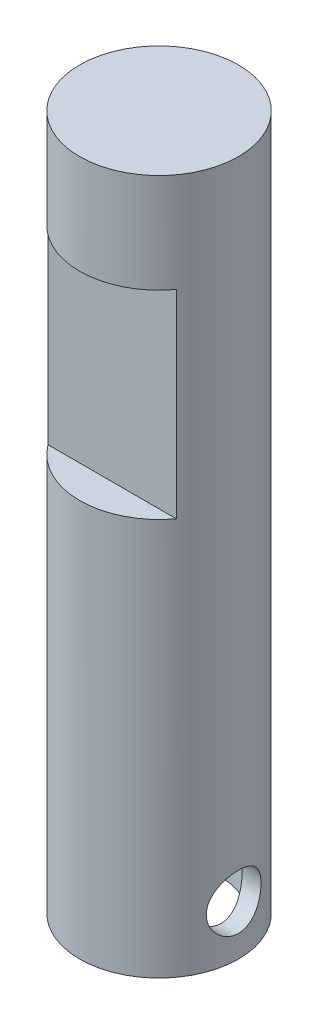
ISO-10303-21;
HEADER;
FILE_DESCRIPTION(('STEP AP214'),'2;1');
FILE_NAME('part.step','',(''),(''),'','','');
FILE_SCHEMA(('AUTOMOTIVE_DESIGN { 1 0 10303 214 1 1 1 1 }'));
ENDSEC;
DATA;
#1=APPLICATION_CONTEXT('core data for automotive mechanical design processes');
#2=APPLICATION_PROTOCOL_DEFINITION('international standard','automotive_design',2000,#1);
#3=PRODUCT_CONTEXT('',#1,'mechanical');
#4=PRODUCT('Part','Part','',(#3));
#5=PRODUCT_RELATED_PRODUCT_CATEGORY('part','',(#4));
#6=PRODUCT_DEFINITION_FORMATION('','',#4);
#7=PRODUCT_DEFINITION_CONTEXT('part definition',#1,'design');
#8=PRODUCT_DEFINITION('design','',#6,#7);
#9=PRODUCT_DEFINITION_SHAPE('','',#8);
#10=(LENGTH_UNIT() NAMED_UNIT(*) SI_UNIT(.MILLI.,.METRE.));
#11=(NAMED_UNIT(*) PLANE_ANGLE_UNIT() SI_UNIT($,.RADIAN.));
#12=(NAMED_UNIT(*) SI_UNIT($,.STERADIAN.) SOLID_ANGLE_UNIT());
#13=UNCERTAINTY_MEASURE_WITH_UNIT(LENGTH_MEASURE(1.E-05),#10,'distance_accuracy_value','');
#14=(GEOMETRIC_REPRESENTATION_CONTEXT(3) GLOBAL_UNCERTAINTY_ASSIGNED_CONTEXT((#13)) GLOBAL_UNIT_ASSIGNED_CONTEXT((#10,
#11,#12)) REPRESENTATION_CONTEXT('',''));
#15=CARTESIAN_POINT('',(0.,0.,0.));
#16=DIRECTION('',(0.,0.,1.));
#17=DIRECTION('',(1.,0.,0.));
#18=AXIS2_PLACEMENT_3D('',#15,#16,#17);
#19=CARTESIAN_POINT('',(-4.09956095210207,44.45,3.));
#20=DIRECTION('',(0.,0.,-1.));
#21=DIRECTION('',(1.,0.,0.));
#22=AXIS2_PLACEMENT_3D('',#19,#20,#21);
#23=PLANE('',#22);
#24=DIRECTION('',(0.,-1.,0.));
#25=VECTOR('',#24,1.);
#26=CARTESIAN_POINT('',(-4.09956095210207,44.45,3.));
#27=LINE('',#26,#25);
#28=CARTESIAN_POINT('',(-4.09956095210207,38.1,3.));
#29=VERTEX_POINT('',#28);
#30=CARTESIAN_POINT('',(-4.09956095210207,25.4,3.));
#31=VERTEX_POINT('',#30);
#32=EDGE_CURVE('E56',#29,#31,#27,.T.);
#33=ORIENTED_EDGE('',*,*,#32,.T.);
#34=DIRECTION('',(-1.,0.,0.));
#35=VECTOR('',#34,1.);
#36=CARTESIAN_POINT('',(-4.09956095210207,25.4,3.));
#37=LINE('',#36,#35);
#38=CARTESIAN_POINT('',(4.09956095210207,25.4,3.));
#39=VERTEX_POINT('',#38);
#40=EDGE_CURVE('E150',#39,#31,#37,.T.);
#41=ORIENTED_EDGE('',*,*,#40,.F.);
#42=DIRECTION('',(0.,-1.,0.));
#43=VECTOR('',#42,1.);
#44=CARTESIAN_POINT('',(4.09956095210207,44.45,3.));
#45=LINE('',#44,#43);
#46=CARTESIAN_POINT('',(4.09956095210207,38.1,3.));
#47=VERTEX_POINT('',#46);
#48=EDGE_CURVE('E11',#47,#39,#45,.T.);
#49=ORIENTED_EDGE('',*,*,#48,.F.);
#50=DIRECTION('',(1.,0.,0.));
#51=VECTOR('',#50,1.);
#52=CARTESIAN_POINT('',(-4.09956095210207,38.1,3.));
#53=LINE('',#52,#51);
#54=EDGE_CURVE('E77',#29,#47,#53,.T.);
#55=ORIENTED_EDGE('',*,*,#54,.F.);
#56=EDGE_LOOP('',(#33,#41,#49,#55));
#57=FACE_BOUND('',#56,.T.);
#58=ADVANCED_FACE('F41',(#57),#23,.F.);
#59=CARTESIAN_POINT('',(0.,44.45,0.));
#60=DIRECTION('',(0.,-1.,0.));
#61=DIRECTION('',(0.,0.,1.));
#62=AXIS2_PLACEMENT_3D('',#59,#60,#61);
#63=CYLINDRICAL_SURFACE('',#62,5.08);
#64=CARTESIAN_POINT('',(-5.08,1.425,0.));
#65=CARTESIAN_POINT('',(-5.08000076417139,1.42499888298344,0.0953022894046354));
#66=CARTESIAN_POINT('',(-5.07729376806418,1.43281012606838,0.190596676623148));
#67=CARTESIAN_POINT('',(-5.06676259877077,1.46374527864878,0.378367669756982));
#68=CARTESIAN_POINT('',(-5.05893823434203,1.48686976041974,0.47084417022913));
#69=CARTESIAN_POINT('',(-5.03901989437365,1.54753702115389,0.650245310243442));
#70=CARTESIAN_POINT('',(-5.02693334790221,1.58505472238807,0.737179301137623));
#71=CARTESIAN_POINT('',(-4.99971650406148,1.67332640539515,0.903519559470689));
#72=CARTESIAN_POINT('',(-4.98458554458919,1.72408326715122,0.982924183876474));
#73=CARTESIAN_POINT('',(-4.95224369163693,1.83934569213979,1.13486510405637));
#74=CARTESIAN_POINT('',(-4.93498055615565,1.90425047545211,1.20708735593848));
#75=CARTESIAN_POINT('',(-4.90059932312551,2.04511803291619,1.3398654200046));
#76=CARTESIAN_POINT('',(-4.88348126144282,2.12108346175875,1.40041842329567));
#77=CARTESIAN_POINT('',(-4.85074524283585,2.28480469580415,1.50998326193888));
#78=CARTESIAN_POINT('',(-4.83519045490759,2.37285359415443,1.5585778443389));
#79=CARTESIAN_POINT('',(-4.80814126026735,2.55649635413827,1.64013337052184));
#80=CARTESIAN_POINT('',(-4.7966455179427,2.65208772126229,1.673099458024));
#81=CARTESIAN_POINT('',(-4.77956823029384,2.84451762278586,1.72126802641745));
#82=CARTESIAN_POINT('',(-4.77379041311777,2.94119014167376,1.73706200636142));
#83=CARTESIAN_POINT('',(-4.7682240603983,3.1359725044686,1.75228747211399));
#84=CARTESIAN_POINT('',(-4.76843352235059,3.23408185683982,1.75172442868868));
#85=CARTESIAN_POINT('',(-4.77464676631466,3.42381842371857,1.73470925747026));
#86=CARTESIAN_POINT('',(-4.7803647153572,3.51552693796071,1.7190409084115));
#87=CARTESIAN_POINT('',(-4.7964810683342,3.69492360970281,1.67354289391217));
#88=CARTESIAN_POINT('',(-4.80688006860106,3.78261125340394,1.64371142416492));
#89=CARTESIAN_POINT('',(-4.83138213156251,3.95321003018773,1.57024282036418));
#90=CARTESIAN_POINT('',(-4.84554477898035,4.0360154970476,1.52638105822024));
#91=CARTESIAN_POINT('',(-4.87595471261031,4.19333342515898,1.42625295769855));
#92=CARTESIAN_POINT('',(-4.89220263252777,4.26784335252389,1.36998284472751));
#93=CARTESIAN_POINT('',(-4.92606434263048,4.41084327761265,1.24291697117403));
#94=CARTESIAN_POINT('',(-4.94370366507709,4.47876240132104,1.17148418312147));
#95=CARTESIAN_POINT('',(-4.97756821276516,4.60181183787153,1.0180281654083));
#96=CARTESIAN_POINT('',(-4.99379328315644,4.65694075137539,0.936003778479532));
#97=CARTESIAN_POINT('',(-5.02324014996034,4.75334668663191,0.762419583781975));
#98=CARTESIAN_POINT('',(-5.03642618865668,4.79446126746685,0.670763072389918));
#99=CARTESIAN_POINT('',(-5.05804849306172,4.86050758126078,0.481270310648696));
#100=CARTESIAN_POINT('',(-5.06648652588555,4.88544533544783,0.383436374514577));
#101=CARTESIAN_POINT('',(-5.07736470824786,4.91739674973,0.189191562688342));
#102=CARTESIAN_POINT('',(-5.08006255074176,4.92518108784578,0.0929217284429427));
#103=CARTESIAN_POINT('',(-5.07993527174129,4.92481259103972,-0.0995737310802911));
#104=CARTESIAN_POINT('',(-5.07711115498479,4.91666265540917,-0.195799361214731));
#105=CARTESIAN_POINT('',(-5.06642755118415,4.88526116906746,-0.382327466649308));
#106=CARTESIAN_POINT('',(-5.05872860986491,4.86249079813248,-0.47272106198722));
#107=CARTESIAN_POINT('',(-5.03923022783173,4.80310457615501,-0.648362037037884));
#108=CARTESIAN_POINT('',(-5.02743025855858,4.76648694036023,-0.733608751734102));
#109=CARTESIAN_POINT('',(-5.00051950138979,4.67934532289421,-0.899127908413318));
#110=CARTESIAN_POINT('',(-4.98532728267042,4.62846970369632,-0.979201596971832));
#111=CARTESIAN_POINT('',(-4.95334472883728,4.51466497785025,-1.12992112454148));
#112=CARTESIAN_POINT('',(-4.93655387786689,4.45173197377301,-1.20056390254257));
#113=CARTESIAN_POINT('',(-4.90222616063926,4.31197933022608,-1.33400086887325));
#114=CARTESIAN_POINT('',(-4.88469277729518,4.23463274627004,-1.39624543446077));
#115=CARTESIAN_POINT('',(-4.8516851925527,4.07022171659723,-1.50695005136838));
#116=CARTESIAN_POINT('',(-4.83621104355525,3.98315702368928,-1.5554097519434));
#117=CARTESIAN_POINT('',(-4.80920827570578,3.80159517486444,-1.63700095794269));
#118=CARTESIAN_POINT('',(-4.79767683455897,3.70710339529585,-1.6701434338448));
#119=CARTESIAN_POINT('',(-4.78007607736265,3.51338547077514,-1.7198785637945));
#120=CARTESIAN_POINT('',(-4.77400407556927,3.41416167903974,-1.73647935587622));
#121=CARTESIAN_POINT('',(-4.76832880519632,3.2196445169891,-1.75199936276655));
#122=CARTESIAN_POINT('',(-4.76838950172282,3.124433472804,-1.75183708142949));
#123=CARTESIAN_POINT('',(-4.77413399674614,2.93547219974782,-1.73612009740496));
#124=CARTESIAN_POINT('',(-4.77981741544765,2.84172187264485,-1.7205664343517));
#125=CARTESIAN_POINT('',(-4.79590870235624,2.66037843893273,-1.67517649822772));
#126=CARTESIAN_POINT('',(-4.80621143526942,2.57269589259309,-1.64565729673398));
#127=CARTESIAN_POINT('',(-4.83033550622056,2.40346388522219,-1.57343621637384));
#128=CARTESIAN_POINT('',(-4.84415765713431,2.32191584671541,-1.53073129153142));
#129=CARTESIAN_POINT('',(-4.87455611963841,2.1631952851576,-1.43105993979702));
#130=CARTESIAN_POINT('',(-4.8912299318905,2.08639704796838,-1.37352745048766));
#131=CARTESIAN_POINT('',(-4.92506481046858,1.94324899744513,-1.24676977081576));
#132=CARTESIAN_POINT('',(-4.94222601772023,1.8769022431187,-1.17754116940141));
#133=CARTESIAN_POINT('',(-4.97598182225602,1.75367623225257,-1.02581147627507));
#134=CARTESIAN_POINT('',(-4.9925209515745,1.69732208706302,-0.942869931500976));
#135=CARTESIAN_POINT('',(-5.02237104941033,1.59940724242884,-0.768135099027858));
#136=CARTESIAN_POINT('',(-5.03568258139335,1.5578439602398,-0.676343360289376));
#137=CARTESIAN_POINT('',(-5.057313033813,1.49170746368237,-0.488579092856818));
#138=CARTESIAN_POINT('',(-5.06573637649884,1.46677704899873,-0.392744891698378));
#139=CARTESIAN_POINT('',(-5.07707856770794,1.43342658198853,-0.197936932159695));
#140=CARTESIAN_POINT('',(-5.07999920646593,1.42500115993705,-0.0989642055179746));
#141=CARTESIAN_POINT('',(-5.08,1.425,0.));
#142=B_SPLINE_CURVE_WITH_KNOTS('',3,(#64,#65,#66,#67,#68,#69,#70,#71,#72,#73,#74,#75,#76,#77,
#78,#79,#80,#81,#82,#83,#84,#85,#86,#87,#88,#89,#90,#91,#92,#93,#94,#95,#96,#97,#98,#99,#100,
#101,#102,#103,#104,#105,#106,#107,#108,#109,#110,#111,#112,#113,#114,#115,#116,#117,#118,#119,
#120,#121,#122,#123,#124,#125,#126,#127,#128,#129,#130,#131,#132,#133,#134,#135,#136,#137,#138,
#139,#140,#141),.UNSPECIFIED.,.T.,.F.,(4,2,2,2,2,2,2,2,2,2,2,2,2,2,2,2,2,2,2,2,2,2,2,2,2,2,2,2,
2,2,2,2,2,2,2,2,2,2,4),(0.,0.28554245735073,0.571095586393906,0.856153430964964,
1.14127333743709,1.43582379151039,1.73044505820538,2.03422433359474,2.33790355827745,
2.63075417899062,2.92350685408384,3.20184374340621,3.4802161008948,3.76328930846856,
4.04644874537624,4.34546697981625,4.64451791352625,4.94692583577289,5.24922113312124,
5.53763138501627,5.82598916464153,6.10531183706105,6.38467052321974,6.67163893049573,
6.95870025441647,7.259738612517,7.56078462961697,7.861614696605,8.16229669064574,
8.44651256584106,8.73070924455449,9.00874237277514,9.28683977632026,9.57774034565015,
9.86872590007664,10.1721342268066,10.4754895470881,10.7721002657753,11.0686144692629),.UNSPECIFIED.);
#143=CARTESIAN_POINT('',(-5.08,1.425,0.));
#144=VERTEX_POINT('',#143);
#145=EDGE_CURVE('E129',#144,#144,#142,.T.);
#146=ORIENTED_EDGE('',*,*,#145,.F.);
#147=EDGE_LOOP('',(#146));
#148=FACE_BOUND('',#147,.T.);
#149=CARTESIAN_POINT('',(4.7690565104641,3.175,1.75));
#150=CARTESIAN_POINT('',(4.76905556914904,3.07988747420598,1.75000115055899));
#151=CARTESIAN_POINT('',(4.7719329096654,2.98478292043442,1.74221982424718));
#152=CARTESIAN_POINT('',(4.78306637000255,2.79740440264574,1.71141431450612));
#153=CARTESIAN_POINT('',(4.79132307976023,2.7051307502461,1.68838845925741));
#154=CARTESIAN_POINT('',(4.81217143890979,2.52616153887322,1.62800914605608));
#155=CARTESIAN_POINT('',(4.82475411409451,2.43945486966273,1.59068533102593));
#156=CARTESIAN_POINT('',(4.85282324821151,2.27350401676104,1.50287190862797));
#157=CARTESIAN_POINT('',(4.86831041348106,2.19426165535709,1.45237909754841));
#158=CARTESIAN_POINT('',(4.90116976927398,2.04217469887006,1.3373989035908));
#159=CARTESIAN_POINT('',(4.91859121749096,1.96968747303741,1.27245277915461));
#160=CARTESIAN_POINT('',(4.95294128003509,1.83638763566958,1.13138709657144));
#161=CARTESIAN_POINT('',(4.9698698085748,1.77557704614716,1.05526560723552));
#162=CARTESIAN_POINT('',(5.00190083776634,1.66570978297738,0.891371207438888));
#163=CARTESIAN_POINT('',(5.01693870800215,1.61703114933825,0.80333112554146));
#164=CARTESIAN_POINT('',(5.04291070662366,1.53531811335215,0.619704280453341));
#165=CARTESIAN_POINT('',(5.0538460211813,1.50227918837186,0.524119708290492));
#166=CARTESIAN_POINT('',(5.07003171382049,1.45400588242238,0.331866809154855));
#167=CARTESIAN_POINT('',(5.07547728742448,1.43815852019928,0.235369140953188));
#168=CARTESIAN_POINT('',(5.0807647730657,1.4227652712637,0.0409408557045194));
#169=CARTESIAN_POINT('',(5.08060822560794,1.42321490310604,-0.0569893600078222));
#170=CARTESIAN_POINT('',(5.07483931379797,1.44002222149091,-0.247150116093957));
#171=CARTESIAN_POINT('',(5.06945556883223,1.45571331226731,-0.339447661898226));
#172=CARTESIAN_POINT('',(5.0541275142818,1.50145093581419,-0.520008887816919));
#173=CARTESIAN_POINT('',(5.04418289072104,1.5314984569036,-0.608272289756216));
#174=CARTESIAN_POINT('',(5.02056796587733,1.60546405389829,-0.779672864057162));
#175=CARTESIAN_POINT('',(5.00684890896013,1.64956493134931,-0.862724156143934));
#176=CARTESIAN_POINT('',(4.97710307831595,1.75023214660339,-1.02043880070284));
#177=CARTESIAN_POINT('',(4.96107563374108,1.80680211063098,-1.09509970354941));
#178=CARTESIAN_POINT('',(4.92744592703843,1.93412390476673,-1.23787149472358));
#179=CARTESIAN_POINT('',(4.90980499463016,2.00544398626107,-1.30546727076063));
#180=CARTESIAN_POINT('',(4.87560416397293,2.15854768847578,-1.42791298131385));
#181=CARTESIAN_POINT('',(4.85904445714819,2.24033315448165,-1.48276066323594));
#182=CARTESIAN_POINT('',(4.82866075249325,2.41377958306261,-1.57893310908967));
#183=CARTESIAN_POINT('',(4.81488521319719,2.50557860981672,-1.62002537024872));
#184=CARTESIAN_POINT('',(4.79218901649874,2.69538908468421,-1.68598805538193));
#185=CARTESIAN_POINT('',(4.78326615735245,2.79339769283005,-1.71086583716083));
#186=CARTESIAN_POINT('',(4.77178917017154,2.98782735160336,-1.7426133044508));
#187=CARTESIAN_POINT('',(4.76895099785174,3.08410034468289,-1.75028695290477));
#188=CARTESIAN_POINT('',(4.76916800232093,3.2765797249177,-1.74969675244721));
#189=CARTESIAN_POINT('',(4.77222201305147,3.37278612148323,-1.74143605693008));
#190=CARTESIAN_POINT('',(4.78359466867962,3.558629134808,-1.70993596023239));
#191=CARTESIAN_POINT('',(4.79171128864077,3.64837679174769,-1.68727074722903));
#192=CARTESIAN_POINT('',(4.81206786840227,3.82277176693781,-1.62830249292802));
#193=CARTESIAN_POINT('',(4.82430858986062,3.90741813965295,-1.59199693232564));
#194=CARTESIAN_POINT('',(4.85203832915389,4.07233565336124,-1.50540713933863));
#195=CARTESIAN_POINT('',(4.86762197904012,4.15236708169748,-1.45469749836615));
#196=CARTESIAN_POINT('',(4.90010462316924,4.30307419797249,-1.34121326936852));
#197=CARTESIAN_POINT('',(4.91700402923975,4.37374693782527,-1.27843489476082));
#198=CARTESIAN_POINT('',(4.95127565012691,4.5075284691492,-1.1387263364332));
#199=CARTESIAN_POINT('',(4.96862682758683,4.5700536791983,-1.06123044254898));
#200=CARTESIAN_POINT('',(5.00098757627087,4.68125832759988,-0.896418310268707));
#201=CARTESIAN_POINT('',(5.01599721243007,4.72993814994025,-0.809102344316199));
#202=CARTESIAN_POINT('',(5.0419258298284,4.81164702246801,-0.627485452305796));
#203=CARTESIAN_POINT('',(5.05286892162005,4.84476863695764,-0.533229799201697));
#204=CARTESIAN_POINT('',(5.06953271796469,4.89454028155123,-0.3400313655671));
#205=CARTESIAN_POINT('',(5.0752554510321,4.9111967098682,-0.241090421370121));
#206=CARTESIAN_POINT('',(5.08067037137377,4.92695893509937,-0.0466503973213572));
#207=CARTESIAN_POINT('',(5.08064956160638,4.92689998953546,0.0487736803247511));
#208=CARTESIAN_POINT('',(5.07529708655824,4.91131621938358,0.238189174721599));
#209=CARTESIAN_POINT('',(5.06996590259638,4.89579279645671,0.332180720529504));
#210=CARTESIAN_POINT('',(5.05470419403585,4.85028507686571,0.514375710295137));
#211=CARTESIAN_POINT('',(5.044857826666,4.82056498260139,0.602652706525786));
#212=CARTESIAN_POINT('',(5.02158108655565,4.74775637973396,0.772995362710569));
#213=CARTESIAN_POINT('',(5.00815005263131,4.70466540466266,0.855059873197275));
#214=CARTESIAN_POINT('',(4.97843483147227,4.60443590945816,1.01409288438825));
#215=CARTESIAN_POINT('',(4.96206078335882,4.54682088677738,1.09074403385586));
#216=CARTESIAN_POINT('',(4.92850099023844,4.4199733722534,1.23355969183976));
#217=CARTESIAN_POINT('',(4.91131497883972,4.35073704836595,1.29972072727337));
#218=CARTESIAN_POINT('',(4.8771902232275,4.19909083817359,1.42255286974433));
#219=CARTESIAN_POINT('',(4.86029319551149,4.11624542909985,1.47869968866723));
#220=CARTESIAN_POINT('',(4.82954132449233,3.94176306862256,1.57624826071803));
#221=CARTESIAN_POINT('',(4.81568594921604,3.85012765859078,1.61765259303836));
#222=CARTESIAN_POINT('',(4.7930480532757,3.66270261896825,1.68353371659624));
#223=CARTESIAN_POINT('',(4.78415804925797,3.56705351730717,1.70837163007594));
#224=CARTESIAN_POINT('',(4.77216395819655,3.37259919871254,1.74160078741207));
#225=CARTESIAN_POINT('',(4.76905748822704,3.27379529869097,1.74999880489118));
#226=CARTESIAN_POINT('',(4.7690565104641,3.175,1.75));
#227=B_SPLINE_CURVE_WITH_KNOTS('',3,(#149,#150,#151,#152,#153,#154,#155,#156,#157,#158,#159,
#160,#161,#162,#163,#164,#165,#166,#167,#168,#169,#170,#171,#172,#173,#174,#175,#176,#177,#178,
#179,#180,#181,#182,#183,#184,#185,#186,#187,#188,#189,#190,#191,#192,#193,#194,#195,#196,#197,
#198,#199,#200,#201,#202,#203,#204,#205,#206,#207,#208,#209,#210,#211,#212,#213,#214,#215,#216,
#217,#218,#219,#220,#221,#222,#223,#224,#225,#226),.UNSPECIFIED.,.T.,.F.,(4,2,2,2,2,2,2,2,2,2,2,
2,2,2,2,2,2,2,2,2,2,2,2,2,2,2,2,2,2,2,2,2,2,2,2,2,2,2,4),(0.,0.284971195180313,
0.569973647431364,0.854388394918185,1.13887239857133,1.4341628580342,1.72950440615435,
2.03313995737502,2.33668765066606,2.62901507806795,2.92126212013066,3.20127759380623,
3.48131234695925,3.76514955734467,4.04906942163075,4.34720470444387,4.64539262791601,
4.94839242856386,5.25125463808838,5.53963969117045,5.82796767892785,6.10546728392768,
6.38301816694734,6.66981576058982,6.95670348468211,7.25849315026459,7.56027444519834,
7.860236796492,8.16008253942545,8.4449479428232,8.7297875290905,9.00952129986325,
9.28930670261408,9.57985194581197,9.87049318319931,10.173514791287,10.4764833597812,
10.7726107243924,11.0686160518835),.UNSPECIFIED.);
#228=CARTESIAN_POINT('',(4.7690565104641,3.175,1.75));
#229=VERTEX_POINT('',#228);
#230=EDGE_CURVE('E132',#229,#229,#227,.T.);
#231=ORIENTED_EDGE('',*,*,#230,.F.);
#232=EDGE_LOOP('',(#231));
#233=FACE_BOUND('',#232,.T.);
#234=CARTESIAN_POINT('',(0.,38.1,0.));
#235=DIRECTION('',(0.,-1.,0.));
#236=DIRECTION('',(0.,0.,1.));
#237=AXIS2_PLACEMENT_3D('',#234,#235,#236);
#238=CIRCLE('',#237,5.08);
#239=EDGE_CURVE('E74',#47,#29,#238,.T.);
#240=ORIENTED_EDGE('',*,*,#239,.F.);
#241=ORIENTED_EDGE('',*,*,#48,.T.);
#242=CARTESIAN_POINT('',(0.,25.4,0.));
#243=DIRECTION('',(0.,1.,0.));
#244=DIRECTION('',(0.,0.,1.));
#245=AXIS2_PLACEMENT_3D('',#242,#243,#244);
#246=CIRCLE('',#245,5.08);
#247=EDGE_CURVE('E63',#31,#39,#246,.T.);
#248=ORIENTED_EDGE('',*,*,#247,.F.);
#249=ORIENTED_EDGE('',*,*,#32,.F.);
#250=EDGE_LOOP('',(#240,#241,#248,#249));
#251=FACE_BOUND('',#250,.T.);
#252=CARTESIAN_POINT('',(0.,0.,0.));
#253=DIRECTION('',(0.,-1.,0.));
#254=DIRECTION('',(0.,0.,-1.));
#255=AXIS2_PLACEMENT_3D('',#252,#253,#254);
#256=CIRCLE('',#255,5.08);
#257=CARTESIAN_POINT('',(0.,0.,-5.08));
#258=VERTEX_POINT('',#257);
#259=EDGE_CURVE('E89',#258,#258,#256,.T.);
#260=ORIENTED_EDGE('',*,*,#259,.F.);
#261=EDGE_LOOP('',(#260));
#262=FACE_BOUND('',#261,.T.);
#263=CARTESIAN_POINT('',(0.,44.45,0.));
#264=DIRECTION('',(0.,-1.,0.));
#265=DIRECTION('',(0.,0.,-1.));
#266=AXIS2_PLACEMENT_3D('',#263,#264,#265);
#267=CIRCLE('',#266,5.08);
#268=CARTESIAN_POINT('',(0.,44.45,-5.08));
#269=VERTEX_POINT('',#268);
#270=EDGE_CURVE('E86',#269,#269,#267,.T.);
#271=ORIENTED_EDGE('',*,*,#270,.T.);
#272=EDGE_LOOP('',(#271));
#273=FACE_BOUND('',#272,.T.);
#274=ADVANCED_FACE('F43',(#148,#233,#251,#262,#273),#63,.T.);
#275=CARTESIAN_POINT('',(0.,44.45,0.));
#276=DIRECTION('',(0.,1.,0.));
#277=DIRECTION('',(0.,0.,-1.));
#278=AXIS2_PLACEMENT_3D('',#275,#276,#277);
#279=PLANE('',#278);
#280=ORIENTED_EDGE('',*,*,#270,.F.);
#281=EDGE_LOOP('',(#280));
#282=FACE_BOUND('',#281,.T.);
#283=ADVANCED_FACE('F113',(#282),#279,.T.);
#284=CARTESIAN_POINT('',(0.,0.,0.));
#285=DIRECTION('',(0.,1.,0.));
#286=DIRECTION('',(0.,0.,-1.));
#287=AXIS2_PLACEMENT_3D('',#284,#285,#286);
#288=PLANE('',#287);
#289=CARTESIAN_POINT('',(0.,0.,0.));
#290=DIRECTION('',(0.,1.,0.));
#291=DIRECTION('',(0.,0.,1.));
#292=AXIS2_PLACEMENT_3D('',#289,#290,#291);
#293=CIRCLE('',#292,3.96875);
#294=CARTESIAN_POINT('',(0.,0.,3.96875));
#295=VERTEX_POINT('',#294);
#296=EDGE_CURVE('E135',#295,#295,#293,.T.);
#297=ORIENTED_EDGE('',*,*,#296,.T.);
#298=EDGE_LOOP('',(#297));
#299=FACE_BOUND('',#298,.T.);
#300=ORIENTED_EDGE('',*,*,#259,.T.);
#301=EDGE_LOOP('',(#300));
#302=FACE_BOUND('',#301,.T.);
#303=ADVANCED_FACE('F112',(#299,#302),#288,.F.);
#304=CARTESIAN_POINT('',(0.,25.4,0.));
#305=DIRECTION('',(0.,-1.,0.));
#306=DIRECTION('',(0.,0.,1.));
#307=AXIS2_PLACEMENT_3D('',#304,#305,#306);
#308=PLANE('',#307);
#309=ORIENTED_EDGE('',*,*,#247,.T.);
#310=ORIENTED_EDGE('',*,*,#40,.T.);
#311=EDGE_LOOP('',(#309,#310));
#312=FACE_BOUND('',#311,.T.);
#313=ADVANCED_FACE('F109',(#312),#308,.F.);
#314=CARTESIAN_POINT('',(0.,38.1,0.));
#315=DIRECTION('',(0.,-1.,0.));
#316=DIRECTION('',(0.,0.,1.));
#317=AXIS2_PLACEMENT_3D('',#314,#315,#316);
#318=PLANE('',#317);
#319=ORIENTED_EDGE('',*,*,#239,.T.);
#320=ORIENTED_EDGE('',*,*,#54,.T.);
#321=EDGE_LOOP('',(#319,#320));
#322=FACE_BOUND('',#321,.T.);
#323=ADVANCED_FACE('F76',(#322),#318,.T.);
#324=CARTESIAN_POINT('',(0.,6.35,0.));
#325=DIRECTION('',(0.,-1.,0.));
#326=DIRECTION('',(0.,0.,1.));
#327=AXIS2_PLACEMENT_3D('',#324,#325,#326);
#328=CYLINDRICAL_SURFACE('',#327,3.96875);
#329=CARTESIAN_POINT('',(-3.56208879205727,3.175,1.75));
#330=CARTESIAN_POINT('',(-3.56209353838593,3.08224740691797,1.74999563319547));
#331=CARTESIAN_POINT('',(-3.56576407056318,2.98934259981376,1.74257902061585));
#332=CARTESIAN_POINT('',(-3.57995211973844,2.80626235860172,1.71323438723364));
#333=CARTESIAN_POINT('',(-3.5904871603377,2.71609452964493,1.69126922476247));
#334=CARTESIAN_POINT('',(-3.61696251479822,2.54146570624595,1.63387370994394));
#335=CARTESIAN_POINT('',(-3.63287896212464,2.45698145522823,1.59850273000797));
#336=CARTESIAN_POINT('',(-3.66828751091445,2.29516823960994,1.51547774519868));
#337=CARTESIAN_POINT('',(-3.68777906305451,2.21783817849355,1.46782562689624));
#338=CARTESIAN_POINT('',(-3.72966266869336,2.06708166582086,1.35803293293338));
#339=CARTESIAN_POINT('',(-3.75216027824898,1.99421391145088,1.29516509833842));
#340=CARTESIAN_POINT('',(-3.7966585858724,1.85963705486942,1.15824885061117));
#341=CARTESIAN_POINT('',(-3.81865907520989,1.79793256639501,1.08419583778055));
#342=CARTESIAN_POINT('',(-3.86099382006362,1.68446054672912,0.922506160523575));
#343=CARTESIAN_POINT('',(-3.88119127911691,1.63333780227249,0.83437788622718));
#344=CARTESIAN_POINT('',(-3.91633169743546,1.54688960151139,0.649718371395728));
#345=CARTESIAN_POINT('',(-3.93127725444704,1.51155633290805,0.553191314708836));
#346=CARTESIAN_POINT('',(-3.95347834999868,1.45976542764851,0.360355757586166));
#347=CARTESIAN_POINT('',(-3.96112637963048,1.44233993556338,0.264353338726685));
#348=CARTESIAN_POINT('',(-3.96930722106238,1.42371534042764,0.0705036002533178));
#349=CARTESIAN_POINT('',(-3.96984328957249,1.42250881038484,-0.0273428543820264));
#350=CARTESIAN_POINT('',(-3.96395886355778,1.43588531871159,-0.215001917879778));
#351=CARTESIAN_POINT('',(-3.95800899588929,1.4494001107015,-0.304908340775179));
#352=CARTESIAN_POINT('',(-3.9404855814644,1.48998259360306,-0.481024011713773));
#353=CARTESIAN_POINT('',(-3.92891161837739,1.5170512878636,-0.567232985534499));
#354=CARTESIAN_POINT('',(-3.90101968793415,1.58426926754532,-0.735104863073158));
#355=CARTESIAN_POINT('',(-3.88463198291737,1.62461196920836,-0.816678254143855));
#356=CARTESIAN_POINT('',(-3.84868139397731,1.71702809000756,-0.972111971682959));
#357=CARTESIAN_POINT('',(-3.82911735624179,1.76910577458765,-1.04596947925099));
#358=CARTESIAN_POINT('',(-3.78695193640457,1.88819626988817,-1.18997020754851));
#359=CARTESIAN_POINT('',(-3.7642326663637,1.95605425426668,-1.25938087431697));
#360=CARTESIAN_POINT('',(-3.71941135415986,2.10243498505653,-1.38617737278033));
#361=CARTESIAN_POINT('',(-3.69730961437482,2.18096284941567,-1.44355740002509));
#362=CARTESIAN_POINT('',(-3.65532460083709,2.3504296743786,-1.54687431413554));
#363=CARTESIAN_POINT('',(-3.63556733412784,2.44174233830917,-1.59225401038565));
#364=CARTESIAN_POINT('',(-3.60205795871447,2.63181194458514,-1.66668544323578));
#365=CARTESIAN_POINT('',(-3.58830096562557,2.7305627549909,-1.69575046597237));
#366=CARTESIAN_POINT('',(-3.56960518418745,2.92534472715134,-1.73474330947598));
#367=CARTESIAN_POINT('',(-3.56411638258773,3.02108214651399,-1.74586863973841));
#368=CARTESIAN_POINT('',(-3.56100105508922,3.21319290466881,-1.75221765766862));
#369=CARTESIAN_POINT('',(-3.56337121546327,3.30956595834333,-1.74744804742538));
#370=CARTESIAN_POINT('',(-3.57513324783105,3.49252520823142,-1.7232383324921));
#371=CARTESIAN_POINT('',(-3.58398179461918,3.57930117106894,-1.70493236127572));
#372=CARTESIAN_POINT('',(-3.60697879849733,3.74845544413854,-1.65572114712787));
#373=CARTESIAN_POINT('',(-3.62112859785241,3.83083263457101,-1.62481271310638));
#374=CARTESIAN_POINT('',(-3.65389481747196,3.99296259218139,-1.54976490211927));
#375=CARTESIAN_POINT('',(-3.67268195932917,4.07243551616474,-1.50509802943803));
#376=CARTESIAN_POINT('',(-3.71238927150009,4.22316743507872,-1.40430554568507));
#377=CARTESIAN_POINT('',(-3.73331043383616,4.29442257679055,-1.34817459314898));
#378=CARTESIAN_POINT('',(-3.77727956071602,4.43362099149512,-1.21989455557735));
#379=CARTESIAN_POINT('',(-3.80034398865355,4.50063639388688,-1.14674005876275));
#380=CARTESIAN_POINT('',(-3.84422469457359,4.62164138857364,-0.989723349920827));
#381=CARTESIAN_POINT('',(-3.86504067624988,4.67562926522068,-0.905859729786865));
#382=CARTESIAN_POINT('',(-3.90233949997183,4.76925178626268,-0.728677439196114));
#383=CARTESIAN_POINT('',(-3.91878776807016,4.80877279273064,-0.635290981699206));
#384=CARTESIAN_POINT('',(-3.94522903213664,4.8712202956881,-0.442273890308923));
#385=CARTESIAN_POINT('',(-3.95522638147468,4.89415798460713,-0.34264751730459));
#386=CARTESIAN_POINT('',(-3.96708486555638,4.92125842265785,-0.148218466465073));
#387=CARTESIAN_POINT('',(-3.96951062715961,4.92672486607173,-0.0536309408712299));
#388=CARTESIAN_POINT('',(-3.96757122067091,4.92232672090087,0.135104825907965));
#389=CARTESIAN_POINT('',(-3.96320751248676,4.91246542816763,0.229253157165397));
#390=CARTESIAN_POINT('',(-3.94849255842105,4.87862346373568,0.4102177359374));
#391=CARTESIAN_POINT('',(-3.93840800526532,4.85527088780818,0.497175040256969));
#392=CARTESIAN_POINT('',(-3.913420989435,4.79583685216382,0.665875986453617));
#393=CARTESIAN_POINT('',(-3.89851767217411,4.7597531345322,0.747618700465384));
#394=CARTESIAN_POINT('',(-3.86445798292642,4.6740574513603,0.907714806758724));
#395=CARTESIAN_POINT('',(-3.84513801057888,4.62390132695005,0.985741229116449));
#396=CARTESIAN_POINT('',(-3.80446881641556,4.51223907776838,1.13261229457055));
#397=CARTESIAN_POINT('',(-3.78311874898595,4.45072821317317,1.20145308254436));
#398=CARTESIAN_POINT('',(-3.73869080353766,4.31251361184784,1.33356456338859));
#399=CARTESIAN_POINT('',(-3.71560713068347,4.23500231939152,1.39599136661912));
#400=CARTESIAN_POINT('',(-3.67193674837275,4.06996527552658,1.50712793845824));
#401=CARTESIAN_POINT('',(-3.65135157638443,3.98243342162634,1.55582928514161));
#402=CARTESIAN_POINT('',(-3.61524974380851,3.79920497474954,1.6379790330275));
#403=CARTESIAN_POINT('',(-3.59974592369513,3.70348845643481,1.67138887600855));
#404=CARTESIAN_POINT('',(-3.57621311955068,3.50702445583213,1.72117916216989));
#405=CARTESIAN_POINT('',(-3.56815906490183,3.4062950584507,1.73761674380392));
#406=CARTESIAN_POINT('',(-3.56366883587143,3.28332782715188,1.74677964847133));
#407=CARTESIAN_POINT('',(-3.56307756802898,3.26168661239528,1.74798610752484));
#408=CARTESIAN_POINT('',(-3.5622869863916,3.21836637296077,1.74959680371416));
#409=CARTESIAN_POINT('',(-3.56208768227397,3.19668734736256,1.75000102104323));
#410=CARTESIAN_POINT('',(-3.56208879205727,3.175,1.75));
#411=B_SPLINE_CURVE_WITH_KNOTS('',3,(#329,#330,#331,#332,#333,#334,#335,#336,#337,#338,#339,
#340,#341,#342,#343,#344,#345,#346,#347,#348,#349,#350,#351,#352,#353,#354,#355,#356,#357,#358,
#359,#360,#361,#362,#363,#364,#365,#366,#367,#368,#369,#370,#371,#372,#373,#374,#375,#376,#377,
#378,#379,#380,#381,#382,#383,#384,#385,#386,#387,#388,#389,#390,#391,#392,#393,#394,#395,#396,
#397,#398,#399,#400,#401,#402,#403,#404,#405,#406,#407,#408,#409,#410),.UNSPECIFIED.,.T.,.F.,(4,
2,2,2,2,2,2,2,2,2,2,2,2,2,2,2,2,2,2,2,2,2,2,2,2,2,2,2,2,2,2,2,2,2,2,2,2,2,2,2,4),(0.,
0.278166493433298,0.557045882401051,0.834704320937761,1.11232013228369,1.40754438936983,
1.70289038420353,2.01288757708766,2.3227312196294,2.61477292458695,2.90668089315732,
3.17873660303953,3.45081245525045,3.72704262376208,4.0033733591295,4.30113958614739,
4.5990491481955,4.90901711969207,5.21873229581556,5.50676075035845,5.79466777330182,
6.06085047730066,6.32710062375157,6.60519700096026,6.88342324856538,7.18758462827953,
7.49178604241135,7.79832814657264,8.10466316539236,8.38753046958766,8.67033695856148,
8.94093121191268,9.21157348029251,9.4946179362679,9.7777808121338,10.0828667001033,
10.3881393828817,10.6941776402949,10.9991822028825,11.0642212948376,11.1292619925394),.UNSPECIFIED.);
#412=CARTESIAN_POINT('',(-3.56208879205727,3.175,1.75));
#413=VERTEX_POINT('',#412);
#414=EDGE_CURVE('E46',#413,#413,#411,.T.);
#415=ORIENTED_EDGE('',*,*,#414,.F.);
#416=EDGE_LOOP('',(#415));
#417=FACE_BOUND('',#416,.T.);
#418=CARTESIAN_POINT('',(3.56208879205727,3.175,1.75));
#419=CARTESIAN_POINT('',(3.56209353838593,3.26775259308203,1.74999563319547));
#420=CARTESIAN_POINT('',(3.56576407056318,3.36065740018624,1.74257902061585));
#421=CARTESIAN_POINT('',(3.57995211973844,3.54373764139828,1.71323438723364));
#422=CARTESIAN_POINT('',(3.5904871603377,3.63390547035507,1.69126922476247));
#423=CARTESIAN_POINT('',(3.61696251479822,3.80853429375405,1.63387370994394));
#424=CARTESIAN_POINT('',(3.63287896212464,3.89301854477177,1.59850273000797));
#425=CARTESIAN_POINT('',(3.66828751091445,4.05483176039005,1.51547774519868));
#426=CARTESIAN_POINT('',(3.68777906305451,4.13216182150645,1.46782562689624));
#427=CARTESIAN_POINT('',(3.72966266869336,4.28291833417914,1.35803293293338));
#428=CARTESIAN_POINT('',(3.75216027824898,4.35578608854912,1.29516509833842));
#429=CARTESIAN_POINT('',(3.7966585858724,4.49036294513058,1.15824885061117));
#430=CARTESIAN_POINT('',(3.81865907520989,4.55206743360499,1.08419583778055));
#431=CARTESIAN_POINT('',(3.86099382006362,4.66553945327088,0.922506160523575));
#432=CARTESIAN_POINT('',(3.88119127911691,4.71666219772751,0.834377886227179));
#433=CARTESIAN_POINT('',(3.91633169743546,4.80311039848861,0.649718371395727));
#434=CARTESIAN_POINT('',(3.93127725444704,4.83844366709194,0.553191314708836));
#435=CARTESIAN_POINT('',(3.95347834999868,4.89023457235149,0.360355757586165));
#436=CARTESIAN_POINT('',(3.96112637963048,4.90766006443662,0.264353338726685));
#437=CARTESIAN_POINT('',(3.96930722106238,4.92628465957236,0.0705036002533174));
#438=CARTESIAN_POINT('',(3.96984328957249,4.92749118961516,-0.0273428543820268));
#439=CARTESIAN_POINT('',(3.96395886355778,4.91411468128841,-0.215001917879779));
#440=CARTESIAN_POINT('',(3.95800899588929,4.9005998892985,-0.304908340775179));
#441=CARTESIAN_POINT('',(3.9404855814644,4.86001740639694,-0.481024011713773));
#442=CARTESIAN_POINT('',(3.92891161837739,4.8329487121364,-0.567232985534499));
#443=CARTESIAN_POINT('',(3.90101968793415,4.76573073245468,-0.735104863073158));
#444=CARTESIAN_POINT('',(3.88463198291737,4.72538803079164,-0.816678254143855));
#445=CARTESIAN_POINT('',(3.84868139397731,4.63297190999244,-0.972111971682959));
#446=CARTESIAN_POINT('',(3.82911735624179,4.58089422541235,-1.04596947925099));
#447=CARTESIAN_POINT('',(3.78695193640457,4.46180373011183,-1.18997020754851));
#448=CARTESIAN_POINT('',(3.7642326663637,4.39394574573332,-1.25938087431697));
#449=CARTESIAN_POINT('',(3.71941135415986,4.24756501494346,-1.38617737278033));
#450=CARTESIAN_POINT('',(3.69730961437482,4.16903715058433,-1.44355740002509));
#451=CARTESIAN_POINT('',(3.65532460083709,3.9995703256214,-1.54687431413554));
#452=CARTESIAN_POINT('',(3.63556733412784,3.90825766169083,-1.59225401038565));
#453=CARTESIAN_POINT('',(3.60205795871447,3.71818805541486,-1.66668544323578));
#454=CARTESIAN_POINT('',(3.58830096562557,3.6194372450091,-1.69575046597237));
#455=CARTESIAN_POINT('',(3.56960518418745,3.42465527284866,-1.73474330947598));
#456=CARTESIAN_POINT('',(3.56411638258773,3.32891785348601,-1.74586863973841));
#457=CARTESIAN_POINT('',(3.56100105508922,3.13680709533119,-1.75221765766862));
#458=CARTESIAN_POINT('',(3.56337121546327,3.04043404165667,-1.74744804742538));
#459=CARTESIAN_POINT('',(3.57513324783105,2.85747479176858,-1.7232383324921));
#460=CARTESIAN_POINT('',(3.58398179461918,2.77069882893106,-1.70493236127572));
#461=CARTESIAN_POINT('',(3.60697879849733,2.60154455586146,-1.65572114712787));
#462=CARTESIAN_POINT('',(3.62112859785241,2.51916736542899,-1.62481271310638));
#463=CARTESIAN_POINT('',(3.65389481747196,2.35703740781861,-1.54976490211927));
#464=CARTESIAN_POINT('',(3.67268195932917,2.27756448383526,-1.50509802943803));
#465=CARTESIAN_POINT('',(3.71238927150009,2.12683256492128,-1.40430554568507));
#466=CARTESIAN_POINT('',(3.73331043383616,2.05557742320946,-1.34817459314898));
#467=CARTESIAN_POINT('',(3.77727956071602,1.91637900850488,-1.21989455557736));
#468=CARTESIAN_POINT('',(3.80034398865355,1.84936360611312,-1.14674005876275));
#469=CARTESIAN_POINT('',(3.84422469457359,1.72835861142636,-0.989723349920828));
#470=CARTESIAN_POINT('',(3.86504067624988,1.67437073477932,-0.905859729786866));
#471=CARTESIAN_POINT('',(3.90233949997183,1.58074821373732,-0.728677439196115));
#472=CARTESIAN_POINT('',(3.91878776807016,1.54122720726936,-0.635290981699207));
#473=CARTESIAN_POINT('',(3.94522903213664,1.4787797043119,-0.442273890308924));
#474=CARTESIAN_POINT('',(3.95522638147468,1.45584201539287,-0.342647517304591));
#475=CARTESIAN_POINT('',(3.96708486555638,1.42874157734215,-0.148218466465074));
#476=CARTESIAN_POINT('',(3.96951062715961,1.42327513392827,-0.0536309408712306));
#477=CARTESIAN_POINT('',(3.96757122067091,1.42767327909913,0.135104825907965));
#478=CARTESIAN_POINT('',(3.96320751248676,1.43753457183237,0.229253157165396));
#479=CARTESIAN_POINT('',(3.94849255842105,1.47137653626432,0.410217735937399));
#480=CARTESIAN_POINT('',(3.93840800526532,1.49472911219182,0.497175040256968));
#481=CARTESIAN_POINT('',(3.913420989435,1.55416314783618,0.665875986453616));
#482=CARTESIAN_POINT('',(3.89851767217411,1.5902468654678,0.747618700465384));
#483=CARTESIAN_POINT('',(3.86445798292642,1.6759425486397,0.907714806758724));
#484=CARTESIAN_POINT('',(3.84513801057888,1.72609867304995,0.985741229116449));
#485=CARTESIAN_POINT('',(3.80446881641556,1.83776092223162,1.13261229457055));
#486=CARTESIAN_POINT('',(3.78311874898595,1.89927178682683,1.20145308254436));
#487=CARTESIAN_POINT('',(3.73869080353766,2.03748638815215,1.33356456338859));
#488=CARTESIAN_POINT('',(3.71560713068347,2.11499768060848,1.39599136661912));
#489=CARTESIAN_POINT('',(3.67193674837275,2.28003472447342,1.50712793845824));
#490=CARTESIAN_POINT('',(3.65135157638443,2.36756657837366,1.55582928514161));
#491=CARTESIAN_POINT('',(3.61524974380851,2.55079502525046,1.6379790330275));
#492=CARTESIAN_POINT('',(3.59974592369513,2.64651154356518,1.67138887600855));
#493=CARTESIAN_POINT('',(3.57621311955068,2.84297554416787,1.72117916216989));
#494=CARTESIAN_POINT('',(3.56815906490183,2.9437049415493,1.73761674380392));
#495=CARTESIAN_POINT('',(3.56366883587143,3.06667217284812,1.74677964847133));
#496=CARTESIAN_POINT('',(3.56307756802898,3.08831338760472,1.74798610752484));
#497=CARTESIAN_POINT('',(3.5622869863916,3.13163362703923,1.74959680371416));
#498=CARTESIAN_POINT('',(3.56208768227397,3.15331265263744,1.75000102104323));
#499=CARTESIAN_POINT('',(3.56208879205727,3.175,1.75));
#500=B_SPLINE_CURVE_WITH_KNOTS('',3,(#418,#419,#420,#421,#422,#423,#424,#425,#426,#427,#428,
#429,#430,#431,#432,#433,#434,#435,#436,#437,#438,#439,#440,#441,#442,#443,#444,#445,#446,#447,
#448,#449,#450,#451,#452,#453,#454,#455,#456,#457,#458,#459,#460,#461,#462,#463,#464,#465,#466,
#467,#468,#469,#470,#471,#472,#473,#474,#475,#476,#477,#478,#479,#480,#481,#482,#483,#484,#485,
#486,#487,#488,#489,#490,#491,#492,#493,#494,#495,#496,#497,#498,#499),.UNSPECIFIED.,.T.,.F.,(4,
2,2,2,2,2,2,2,2,2,2,2,2,2,2,2,2,2,2,2,2,2,2,2,2,2,2,2,2,2,2,2,2,2,2,2,2,2,2,2,4),(0.,
0.278166493433298,0.557045882401051,0.83470432093776,1.11232013228369,1.40754438936983,
1.70289038420353,2.01288757708766,2.3227312196294,2.61477292458695,2.90668089315732,
3.17873660303953,3.45081245525045,3.72704262376208,4.0033733591295,4.30113958614739,
4.5990491481955,4.90901711969207,5.21873229581556,5.50676075035845,5.79466777330182,
6.06085047730066,6.32710062375157,6.60519700096026,6.88342324856538,7.18758462827953,
7.49178604241135,7.79832814657264,8.10466316539236,8.38753046958766,8.67033695856148,
8.94093121191268,9.21157348029251,9.4946179362679,9.7777808121338,10.0828667001033,
10.3881393828817,10.6941776402949,10.9991822028825,11.0642212948376,11.1292619925394),.UNSPECIFIED.);
#501=CARTESIAN_POINT('',(3.56208879205727,3.175,1.75));
#502=VERTEX_POINT('',#501);
#503=EDGE_CURVE('E92',#502,#502,#500,.T.);
#504=ORIENTED_EDGE('',*,*,#503,.F.);
#505=EDGE_LOOP('',(#504));
#506=FACE_BOUND('',#505,.T.);
#507=CARTESIAN_POINT('',(0.,6.35,0.));
#508=DIRECTION('',(0.,1.,0.));
#509=DIRECTION('',(0.,0.,1.));
#510=AXIS2_PLACEMENT_3D('',#507,#508,#509);
#511=CIRCLE('',#510,3.96875);
#512=CARTESIAN_POINT('',(0.,6.35,3.96875));
#513=VERTEX_POINT('',#512);
#514=EDGE_CURVE('E79',#513,#513,#511,.T.);
#515=ORIENTED_EDGE('',*,*,#514,.T.);
#516=EDGE_LOOP('',(#515));
#517=FACE_BOUND('',#516,.T.);
#518=ORIENTED_EDGE('',*,*,#296,.F.);
#519=EDGE_LOOP('',(#518));
#520=FACE_BOUND('',#519,.T.);
#521=ADVANCED_FACE('F100',(#417,#506,#517,#520),#328,.F.);
#522=CARTESIAN_POINT('',(0.,6.35,0.));
#523=DIRECTION('',(0.,-1.,0.));
#524=DIRECTION('',(0.,0.,1.));
#525=AXIS2_PLACEMENT_3D('',#522,#523,#524);
#526=PLANE('',#525);
#527=ORIENTED_EDGE('',*,*,#514,.F.);
#528=EDGE_LOOP('',(#527));
#529=FACE_BOUND('',#528,.T.);
#530=ADVANCED_FACE('F104',(#529),#526,.T.);
#531=CARTESIAN_POINT('',(-5.08,3.175,0.));
#532=DIRECTION('',(1.,0.,0.));
#533=DIRECTION('',(0.,0.,1.));
#534=AXIS2_PLACEMENT_3D('',#531,#532,#533);
#535=CYLINDRICAL_SURFACE('',#534,1.75);
#536=ORIENTED_EDGE('',*,*,#503,.T.);
#537=EDGE_LOOP('',(#536));
#538=FACE_BOUND('',#537,.T.);
#539=ORIENTED_EDGE('',*,*,#230,.T.);
#540=EDGE_LOOP('',(#539));
#541=FACE_BOUND('',#540,.T.);
#542=ADVANCED_FACE('F162',(#538,#541),#535,.F.);
#543=ORIENTED_EDGE('',*,*,#414,.T.);
#544=EDGE_LOOP('',(#543));
#545=FACE_BOUND('',#544,.T.);
#546=ORIENTED_EDGE('',*,*,#145,.T.);
#547=EDGE_LOOP('',(#546));
#548=FACE_BOUND('',#547,.T.);
#549=ADVANCED_FACE('F97',(#545,#548),#535,.F.);
#550=CLOSED_SHELL('',(#58,#274,#283,#303,#313,#323,#521,#530,#542,#549));
#551=MANIFOLD_SOLID_BREP('B2',#550);
#552=ADVANCED_BREP_SHAPE_REPRESENTATION('',(#18,#551),#14);
#553=SHAPE_DEFINITION_REPRESENTATION(#9,#552);
ENDSEC;
END-ISO-10303-21;
